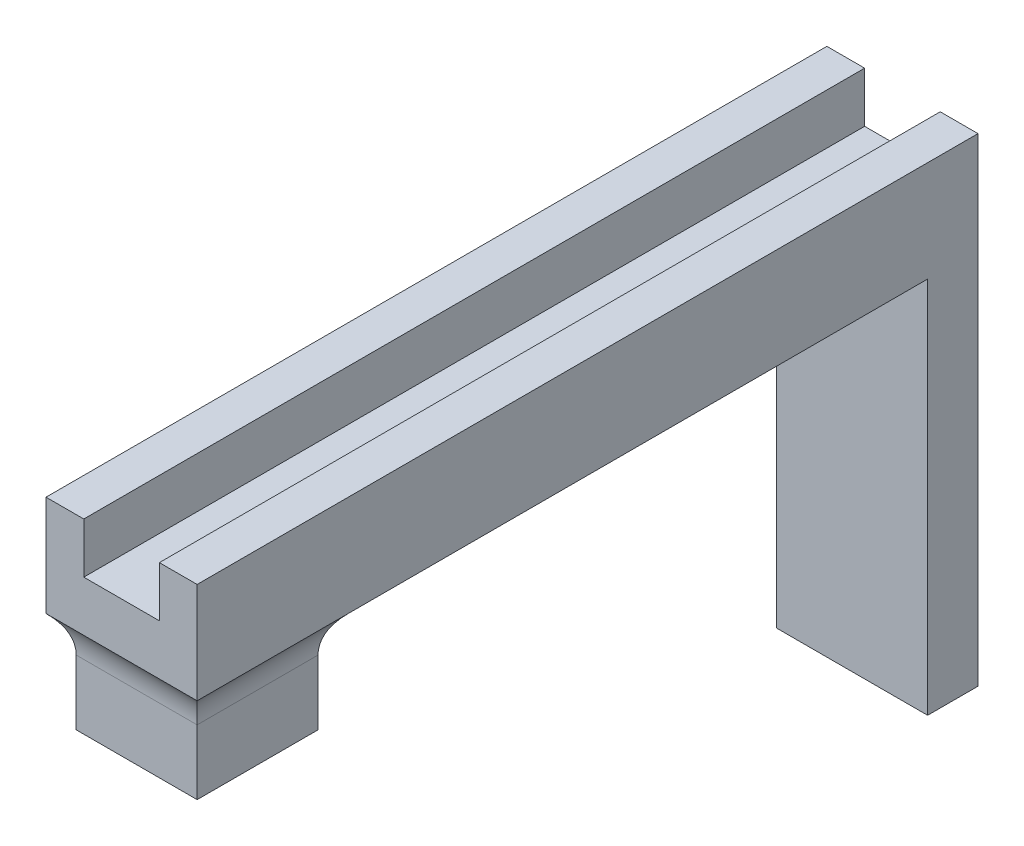
ISO-10303-21;
HEADER;
FILE_DESCRIPTION(('STEP AP214'),'2;1');
FILE_NAME('part.step','',(''),(''),'','','');
FILE_SCHEMA(('AUTOMOTIVE_DESIGN { 1 0 10303 214 1 1 1 1 }'));
ENDSEC;
DATA;
#1=APPLICATION_CONTEXT('core data for automotive mechanical design processes');
#2=APPLICATION_PROTOCOL_DEFINITION('international standard','automotive_design',2000,#1);
#3=PRODUCT_CONTEXT('',#1,'mechanical');
#4=PRODUCT('Part','Part','',(#3));
#5=PRODUCT_RELATED_PRODUCT_CATEGORY('part','',(#4));
#6=PRODUCT_DEFINITION_FORMATION('','',#4);
#7=PRODUCT_DEFINITION_CONTEXT('part definition',#1,'design');
#8=PRODUCT_DEFINITION('design','',#6,#7);
#9=PRODUCT_DEFINITION_SHAPE('','',#8);
#10=(LENGTH_UNIT() NAMED_UNIT(*) SI_UNIT(.MILLI.,.METRE.));
#11=(NAMED_UNIT(*) PLANE_ANGLE_UNIT() SI_UNIT($,.RADIAN.));
#12=(NAMED_UNIT(*) SI_UNIT($,.STERADIAN.) SOLID_ANGLE_UNIT());
#13=UNCERTAINTY_MEASURE_WITH_UNIT(LENGTH_MEASURE(1.E-05),#10,'distance_accuracy_value','');
#14=(GEOMETRIC_REPRESENTATION_CONTEXT(3) GLOBAL_UNCERTAINTY_ASSIGNED_CONTEXT((#13)) GLOBAL_UNIT_ASSIGNED_CONTEXT((#10,
#11,#12)) REPRESENTATION_CONTEXT('',''));
#15=CARTESIAN_POINT('',(0.,0.,0.));
#16=DIRECTION('',(0.,0.,1.));
#17=DIRECTION('',(1.,0.,0.));
#18=AXIS2_PLACEMENT_3D('',#15,#16,#17);
#19=CARTESIAN_POINT('',(6.858,5.08,-38.608));
#20=DIRECTION('',(0.,1.,0.));
#21=DIRECTION('',(0.,0.,1.));
#22=AXIS2_PLACEMENT_3D('',#19,#20,#21);
#23=PLANE('',#22);
#24=DIRECTION('',(-1.,0.,0.));
#25=VECTOR('',#24,1.);
#26=CARTESIAN_POINT('',(-0.762,5.08,-36.068));
#27=LINE('',#26,#25);
#28=CARTESIAN_POINT('',(6.858,5.08,-36.068));
#29=VERTEX_POINT('',#28);
#30=CARTESIAN_POINT('',(-0.762,5.08,-36.068));
#31=VERTEX_POINT('',#30);
#32=EDGE_CURVE('E275',#29,#31,#27,.T.);
#33=ORIENTED_EDGE('',*,*,#32,.F.);
#34=DIRECTION('',(0.,0.,1.));
#35=VECTOR('',#34,1.);
#36=CARTESIAN_POINT('',(6.858,5.08,-38.608));
#37=LINE('',#36,#35);
#38=CARTESIAN_POINT('',(6.858,5.08,-6.858));
#39=VERTEX_POINT('',#38);
#40=EDGE_CURVE('E152',#29,#39,#37,.T.);
#41=ORIENTED_EDGE('',*,*,#40,.T.);
#42=DIRECTION('',(-1.,0.,0.));
#43=VECTOR('',#42,1.);
#44=CARTESIAN_POINT('',(-0.762,5.08,-6.858));
#45=LINE('',#44,#43);
#46=CARTESIAN_POINT('',(-0.762,5.08,-6.858));
#47=VERTEX_POINT('',#46);
#48=EDGE_CURVE('E193',#39,#47,#45,.T.);
#49=ORIENTED_EDGE('',*,*,#48,.T.);
#50=DIRECTION('',(0.,0.,1.));
#51=VECTOR('',#50,1.);
#52=CARTESIAN_POINT('',(-0.762,5.08,-38.608));
#53=LINE('',#52,#51);
#54=EDGE_CURVE('E80',#31,#47,#53,.T.);
#55=ORIENTED_EDGE('',*,*,#54,.F.);
#56=EDGE_LOOP('',(#33,#41,#49,#55));
#57=FACE_BOUND('',#56,.T.);
#58=ADVANCED_FACE('F42',(#57),#23,.F.);
#59=CARTESIAN_POINT('',(0.,10.16,0.));
#60=DIRECTION('',(0.,1.,0.));
#61=DIRECTION('',(0.,0.,1.));
#62=AXIS2_PLACEMENT_3D('',#59,#60,#61);
#63=PLANE('',#62);
#64=DIRECTION('',(0.,0.,1.));
#65=VECTOR('',#64,1.);
#66=CARTESIAN_POINT('',(1.143,10.16,-38.608));
#67=LINE('',#66,#65);
#68=CARTESIAN_POINT('',(1.143,10.16,-38.608));
#69=VERTEX_POINT('',#68);
#70=CARTESIAN_POINT('',(1.14300000000001,10.16,0.762));
#71=VERTEX_POINT('',#70);
#72=EDGE_CURVE('E253',#69,#71,#67,.T.);
#73=ORIENTED_EDGE('',*,*,#72,.F.);
#74=DIRECTION('',(1.,0.,0.));
#75=VECTOR('',#74,1.);
#76=CARTESIAN_POINT('',(6.858,10.16,-38.608));
#77=LINE('',#76,#75);
#78=CARTESIAN_POINT('',(-0.762,10.16,-38.608));
#79=VERTEX_POINT('',#78);
#80=EDGE_CURVE('E218',#79,#69,#77,.T.);
#81=ORIENTED_EDGE('',*,*,#80,.F.);
#82=DIRECTION('',(0.,0.,1.));
#83=VECTOR('',#82,1.);
#84=CARTESIAN_POINT('',(-0.762,10.16,-6.858));
#85=LINE('',#84,#83);
#86=CARTESIAN_POINT('',(-0.761999999999999,10.16,0.762));
#87=VERTEX_POINT('',#86);
#88=EDGE_CURVE('E197',#79,#87,#85,.T.);
#89=ORIENTED_EDGE('',*,*,#88,.T.);
#90=DIRECTION('',(1.,0.,0.));
#91=VECTOR('',#90,1.);
#92=CARTESIAN_POINT('',(-0.761999999999999,10.16,0.762));
#93=LINE('',#92,#91);
#94=EDGE_CURVE('E208',#87,#71,#93,.T.);
#95=ORIENTED_EDGE('',*,*,#94,.T.);
#96=EDGE_LOOP('',(#73,#81,#89,#95));
#97=FACE_BOUND('',#96,.T.);
#98=ADVANCED_FACE('F368',(#97),#63,.T.);
#99=CARTESIAN_POINT('',(0.,5.08,0.));
#100=DIRECTION('',(1.,0.,0.));
#101=DIRECTION('',(0.,0.,-1.));
#102=AXIS2_PLACEMENT_3D('',#99,#100,#101);
#103=PLANE('',#102);
#104=DIRECTION('',(0.,-1.,0.));
#105=VECTOR('',#104,1.);
#106=CARTESIAN_POINT('',(0.,5.08,0.));
#107=LINE('',#106,#105);
#108=CARTESIAN_POINT('',(0.,3.26607717915012,0.));
#109=VERTEX_POINT('',#108);
#110=CARTESIAN_POINT('',(0.,0.,0.));
#111=VERTEX_POINT('',#110);
#112=EDGE_CURVE('E139',#109,#111,#107,.T.);
#113=ORIENTED_EDGE('',*,*,#112,.F.);
#114=DIRECTION('',(0.,0.,-1.));
#115=VECTOR('',#114,1.);
#116=CARTESIAN_POINT('',(0.,3.26607717915012,0.));
#117=LINE('',#116,#115);
#118=CARTESIAN_POINT('',(0.,3.26607717915012,-6.096));
#119=VERTEX_POINT('',#118);
#120=EDGE_CURVE('E145',#109,#119,#117,.T.);
#121=ORIENTED_EDGE('',*,*,#120,.T.);
#122=DIRECTION('',(0.,-1.,0.));
#123=VECTOR('',#122,1.);
#124=CARTESIAN_POINT('',(0.,5.08,-6.096));
#125=LINE('',#124,#123);
#126=CARTESIAN_POINT('',(0.,0.,-6.096));
#127=VERTEX_POINT('',#126);
#128=EDGE_CURVE('E169',#119,#127,#125,.T.);
#129=ORIENTED_EDGE('',*,*,#128,.T.);
#130=DIRECTION('',(0.,0.,1.));
#131=VECTOR('',#130,1.);
#132=CARTESIAN_POINT('',(0.,0.,0.));
#133=LINE('',#132,#131);
#134=EDGE_CURVE('E181',#127,#111,#133,.T.);
#135=ORIENTED_EDGE('',*,*,#134,.T.);
#136=EDGE_LOOP('',(#113,#121,#129,#135));
#137=FACE_BOUND('',#136,.T.);
#138=ADVANCED_FACE('F375',(#137),#103,.F.);
#139=CARTESIAN_POINT('',(0.,5.08,0.));
#140=DIRECTION('',(0.,0.,-1.));
#141=DIRECTION('',(-1.,0.,0.));
#142=AXIS2_PLACEMENT_3D('',#139,#140,#141);
#143=PLANE('',#142);
#144=DIRECTION('',(0.,-1.,0.));
#145=VECTOR('',#144,1.);
#146=CARTESIAN_POINT('',(6.096,5.08,0.));
#147=LINE('',#146,#145);
#148=CARTESIAN_POINT('',(6.096,3.26607717915012,0.));
#149=VERTEX_POINT('',#148);
#150=CARTESIAN_POINT('',(6.096,0.,0.));
#151=VERTEX_POINT('',#150);
#152=EDGE_CURVE('E122',#149,#151,#147,.T.);
#153=ORIENTED_EDGE('',*,*,#152,.F.);
#154=DIRECTION('',(-1.,0.,0.));
#155=VECTOR('',#154,1.);
#156=CARTESIAN_POINT('',(0.,3.26607717915012,0.));
#157=LINE('',#156,#155);
#158=EDGE_CURVE('E130',#149,#109,#157,.T.);
#159=ORIENTED_EDGE('',*,*,#158,.T.);
#160=ORIENTED_EDGE('',*,*,#112,.T.);
#161=DIRECTION('',(1.,0.,0.));
#162=VECTOR('',#161,1.);
#163=CARTESIAN_POINT('',(0.,0.,0.));
#164=LINE('',#163,#162);
#165=EDGE_CURVE('E136',#111,#151,#164,.T.);
#166=ORIENTED_EDGE('',*,*,#165,.T.);
#167=EDGE_LOOP('',(#153,#159,#160,#166));
#168=FACE_BOUND('',#167,.T.);
#169=ADVANCED_FACE('F133',(#168),#143,.F.);
#170=CARTESIAN_POINT('',(6.096,5.08,0.));
#171=DIRECTION('',(-1.,0.,0.));
#172=DIRECTION('',(0.,0.,1.));
#173=AXIS2_PLACEMENT_3D('',#170,#171,#172);
#174=PLANE('',#173);
#175=DIRECTION('',(0.,-1.,0.));
#176=VECTOR('',#175,1.);
#177=CARTESIAN_POINT('',(6.096,5.08,-6.096));
#178=LINE('',#177,#176);
#179=CARTESIAN_POINT('',(6.096,3.26607717915012,-6.096));
#180=VERTEX_POINT('',#179);
#181=CARTESIAN_POINT('',(6.096,0.,-6.096));
#182=VERTEX_POINT('',#181);
#183=EDGE_CURVE('E124',#180,#182,#178,.T.);
#184=ORIENTED_EDGE('',*,*,#183,.F.);
#185=DIRECTION('',(0.,0.,1.));
#186=VECTOR('',#185,1.);
#187=CARTESIAN_POINT('',(6.096,3.26607717915012,0.));
#188=LINE('',#187,#186);
#189=EDGE_CURVE('E118',#180,#149,#188,.T.);
#190=ORIENTED_EDGE('',*,*,#189,.T.);
#191=ORIENTED_EDGE('',*,*,#152,.T.);
#192=DIRECTION('',(0.,0.,-1.));
#193=VECTOR('',#192,1.);
#194=CARTESIAN_POINT('',(6.096,0.,0.));
#195=LINE('',#194,#193);
#196=EDGE_CURVE('E176',#151,#182,#195,.T.);
#197=ORIENTED_EDGE('',*,*,#196,.T.);
#198=EDGE_LOOP('',(#184,#190,#191,#197));
#199=FACE_BOUND('',#198,.T.);
#200=ADVANCED_FACE('F120',(#199),#174,.F.);
#201=CARTESIAN_POINT('',(0.,5.08,-6.096));
#202=DIRECTION('',(0.,0.,1.));
#203=DIRECTION('',(1.,0.,0.));
#204=AXIS2_PLACEMENT_3D('',#201,#202,#203);
#205=PLANE('',#204);
#206=ORIENTED_EDGE('',*,*,#128,.F.);
#207=DIRECTION('',(1.,0.,0.));
#208=VECTOR('',#207,1.);
#209=CARTESIAN_POINT('',(0.,3.26607717915012,-6.096));
#210=LINE('',#209,#208);
#211=EDGE_CURVE('E129',#119,#180,#210,.T.);
#212=ORIENTED_EDGE('',*,*,#211,.T.);
#213=ORIENTED_EDGE('',*,*,#183,.T.);
#214=DIRECTION('',(-1.,0.,0.));
#215=VECTOR('',#214,1.);
#216=CARTESIAN_POINT('',(0.,0.,-6.096));
#217=LINE('',#216,#215);
#218=EDGE_CURVE('E172',#182,#127,#217,.T.);
#219=ORIENTED_EDGE('',*,*,#218,.T.);
#220=EDGE_LOOP('',(#206,#212,#213,#219));
#221=FACE_BOUND('',#220,.T.);
#222=ADVANCED_FACE('F377',(#221),#205,.F.);
#223=CARTESIAN_POINT('',(0.,0.,0.));
#224=DIRECTION('',(0.,-1.,0.));
#225=DIRECTION('',(0.,0.,-1.));
#226=AXIS2_PLACEMENT_3D('',#223,#224,#225);
#227=PLANE('',#226);
#228=ORIENTED_EDGE('',*,*,#134,.F.);
#229=ORIENTED_EDGE('',*,*,#218,.F.);
#230=ORIENTED_EDGE('',*,*,#196,.F.);
#231=ORIENTED_EDGE('',*,*,#165,.F.);
#232=EDGE_LOOP('',(#228,#229,#230,#231));
#233=FACE_BOUND('',#232,.T.);
#234=ADVANCED_FACE('F381',(#233),#227,.T.);
#235=CARTESIAN_POINT('',(-0.762,10.16,-6.858));
#236=DIRECTION('',(1.,0.,0.));
#237=DIRECTION('',(0.,0.,-1.));
#238=AXIS2_PLACEMENT_3D('',#235,#236,#237);
#239=PLANE('',#238);
#240=ORIENTED_EDGE('',*,*,#88,.F.);
#241=DIRECTION('',(0.,1.,0.));
#242=VECTOR('',#241,1.);
#243=CARTESIAN_POINT('',(-0.762,10.16,-38.608));
#244=LINE('',#243,#242);
#245=CARTESIAN_POINT('',(-0.762,-13.97,-38.608));
#246=VERTEX_POINT('',#245);
#247=EDGE_CURVE('E223',#246,#79,#244,.T.);
#248=ORIENTED_EDGE('',*,*,#247,.F.);
#249=DIRECTION('',(0.,0.,-1.));
#250=VECTOR('',#249,1.);
#251=CARTESIAN_POINT('',(-0.762,-13.97,-38.608));
#252=LINE('',#251,#250);
#253=CARTESIAN_POINT('',(-0.762,-13.97,-36.068));
#254=VERTEX_POINT('',#253);
#255=EDGE_CURVE('E279',#254,#246,#252,.T.);
#256=ORIENTED_EDGE('',*,*,#255,.F.);
#257=DIRECTION('',(0.,1.,0.));
#258=VECTOR('',#257,1.);
#259=CARTESIAN_POINT('',(-0.762,-13.97,-36.068));
#260=LINE('',#259,#258);
#261=EDGE_CURVE('E271',#254,#31,#260,.T.);
#262=ORIENTED_EDGE('',*,*,#261,.T.);
#263=ORIENTED_EDGE('',*,*,#54,.T.);
#264=DIRECTION('',(0.,0.,1.));
#265=VECTOR('',#264,1.);
#266=CARTESIAN_POINT('',(-0.762,5.08,-6.858));
#267=LINE('',#266,#265);
#268=CARTESIAN_POINT('',(-0.761999999999999,5.08,0.762));
#269=VERTEX_POINT('',#268);
#270=EDGE_CURVE('E69',#47,#269,#267,.T.);
#271=ORIENTED_EDGE('',*,*,#270,.T.);
#272=DIRECTION('',(0.,-1.,0.));
#273=VECTOR('',#272,1.);
#274=CARTESIAN_POINT('',(-0.761999999999999,10.16,0.762));
#275=LINE('',#274,#273);
#276=EDGE_CURVE('E185',#87,#269,#275,.T.);
#277=ORIENTED_EDGE('',*,*,#276,.F.);
#278=EDGE_LOOP('',(#240,#248,#256,#262,#263,#271,#277));
#279=FACE_BOUND('',#278,.T.);
#280=ADVANCED_FACE('F307',(#279),#239,.F.);
#281=CARTESIAN_POINT('',(-0.761999999999999,10.16,0.762));
#282=DIRECTION('',(0.,0.,-1.));
#283=DIRECTION('',(-1.,0.,0.));
#284=AXIS2_PLACEMENT_3D('',#281,#282,#283);
#285=PLANE('',#284);
#286=DIRECTION('',(1.,0.,0.));
#287=VECTOR('',#286,1.);
#288=CARTESIAN_POINT('',(1.14300000000001,7.62,0.762));
#289=LINE('',#288,#287);
#290=CARTESIAN_POINT('',(1.14300000000001,7.62,0.762));
#291=VERTEX_POINT('',#290);
#292=CARTESIAN_POINT('',(4.953,7.62,0.762));
#293=VERTEX_POINT('',#292);
#294=EDGE_CURVE('E262',#291,#293,#289,.T.);
#295=ORIENTED_EDGE('',*,*,#294,.F.);
#296=DIRECTION('',(0.,1.,0.));
#297=VECTOR('',#296,1.);
#298=CARTESIAN_POINT('',(1.14300000000001,7.62,0.762));
#299=LINE('',#298,#297);
#300=EDGE_CURVE('E232',#291,#71,#299,.T.);
#301=ORIENTED_EDGE('',*,*,#300,.T.);
#302=ORIENTED_EDGE('',*,*,#94,.F.);
#303=ORIENTED_EDGE('',*,*,#276,.T.);
#304=DIRECTION('',(1.,0.,0.));
#305=VECTOR('',#304,1.);
#306=CARTESIAN_POINT('',(-0.761999999999999,5.08,0.762));
#307=LINE('',#306,#305);
#308=CARTESIAN_POINT('',(6.858,5.08,0.762));
#309=VERTEX_POINT('',#308);
#310=EDGE_CURVE('E200',#269,#309,#307,.T.);
#311=ORIENTED_EDGE('',*,*,#310,.T.);
#312=DIRECTION('',(0.,-1.,0.));
#313=VECTOR('',#312,1.);
#314=CARTESIAN_POINT('',(6.858,10.16,0.762));
#315=LINE('',#314,#313);
#316=CARTESIAN_POINT('',(6.858,10.16,0.762));
#317=VERTEX_POINT('',#316);
#318=EDGE_CURVE('E188',#317,#309,#315,.T.);
#319=ORIENTED_EDGE('',*,*,#318,.F.);
#320=CARTESIAN_POINT('',(4.953,10.16,0.762));
#321=VERTEX_POINT('',#320);
#322=EDGE_CURVE('E212',#321,#317,#93,.T.);
#323=ORIENTED_EDGE('',*,*,#322,.F.);
#324=DIRECTION('',(0.,1.,0.));
#325=VECTOR('',#324,1.);
#326=CARTESIAN_POINT('',(4.953,7.62,0.762));
#327=LINE('',#326,#325);
#328=EDGE_CURVE('E236',#293,#321,#327,.T.);
#329=ORIENTED_EDGE('',*,*,#328,.F.);
#330=EDGE_LOOP('',(#295,#301,#302,#303,#311,#319,#323,#329));
#331=FACE_BOUND('',#330,.T.);
#332=ADVANCED_FACE('F350',(#331),#285,.F.);
#333=CARTESIAN_POINT('',(6.858,10.16,-6.858));
#334=DIRECTION('',(-1.,0.,0.));
#335=DIRECTION('',(0.,0.,1.));
#336=AXIS2_PLACEMENT_3D('',#333,#334,#335);
#337=PLANE('',#336);
#338=DIRECTION('',(0.,0.,-1.));
#339=VECTOR('',#338,1.);
#340=CARTESIAN_POINT('',(6.858,5.08,-6.858));
#341=LINE('',#340,#339);
#342=EDGE_CURVE('E149',#309,#39,#341,.T.);
#343=ORIENTED_EDGE('',*,*,#342,.T.);
#344=ORIENTED_EDGE('',*,*,#40,.F.);
#345=DIRECTION('',(0.,1.,0.));
#346=VECTOR('',#345,1.);
#347=CARTESIAN_POINT('',(6.858,-13.97,-36.068));
#348=LINE('',#347,#346);
#349=CARTESIAN_POINT('',(6.858,-13.97,-36.068));
#350=VERTEX_POINT('',#349);
#351=EDGE_CURVE('E257',#350,#29,#348,.T.);
#352=ORIENTED_EDGE('',*,*,#351,.F.);
#353=DIRECTION('',(0.,0.,1.));
#354=VECTOR('',#353,1.);
#355=CARTESIAN_POINT('',(6.858,-13.97,-38.608));
#356=LINE('',#355,#354);
#357=CARTESIAN_POINT('',(6.858,-13.97,-38.608));
#358=VERTEX_POINT('',#357);
#359=EDGE_CURVE('E283',#358,#350,#356,.T.);
#360=ORIENTED_EDGE('',*,*,#359,.F.);
#361=DIRECTION('',(0.,-1.,0.));
#362=VECTOR('',#361,1.);
#363=CARTESIAN_POINT('',(6.858,10.16,-38.608));
#364=LINE('',#363,#362);
#365=CARTESIAN_POINT('',(6.858,10.16,-38.608));
#366=VERTEX_POINT('',#365);
#367=EDGE_CURVE('E227',#366,#358,#364,.T.);
#368=ORIENTED_EDGE('',*,*,#367,.F.);
#369=DIRECTION('',(0.,0.,-1.));
#370=VECTOR('',#369,1.);
#371=CARTESIAN_POINT('',(6.858,10.16,-6.858));
#372=LINE('',#371,#370);
#373=EDGE_CURVE('E192',#317,#366,#372,.T.);
#374=ORIENTED_EDGE('',*,*,#373,.F.);
#375=ORIENTED_EDGE('',*,*,#318,.T.);
#376=EDGE_LOOP('',(#343,#344,#352,#360,#368,#374,#375));
#377=FACE_BOUND('',#376,.T.);
#378=ADVANCED_FACE('F343',(#377),#337,.F.);
#379=DIRECTION('',(0.,0.,-1.));
#380=VECTOR('',#379,1.);
#381=CARTESIAN_POINT('',(4.953,10.16,-38.608));
#382=LINE('',#381,#380);
#383=CARTESIAN_POINT('',(4.953,10.16,-38.608));
#384=VERTEX_POINT('',#383);
#385=EDGE_CURVE('E248',#321,#384,#382,.T.);
#386=ORIENTED_EDGE('',*,*,#385,.F.);
#387=ORIENTED_EDGE('',*,*,#322,.T.);
#388=ORIENTED_EDGE('',*,*,#373,.T.);
#389=EDGE_CURVE('E222',#384,#366,#77,.T.);
#390=ORIENTED_EDGE('',*,*,#389,.F.);
#391=EDGE_LOOP('',(#386,#387,#388,#390));
#392=FACE_BOUND('',#391,.T.);
#393=ADVANCED_FACE('F355',(#392),#63,.T.);
#394=CARTESIAN_POINT('',(-2.54,3.26607717915012,0.));
#395=DIRECTION('',(0.,0.,-1.));
#396=DIRECTION('',(-1.,0.,0.));
#397=AXIS2_PLACEMENT_3D('',#394,#395,#396);
#398=CYLINDRICAL_SURFACE('',#397,2.54);
#399=ORIENTED_EDGE('',*,*,#270,.F.);
#400=CARTESIAN_POINT('',(-2.54,3.26607717915012,-8.636));
#401=DIRECTION('',(0.707106781186547,0.,-0.707106781186548));
#402=DIRECTION('',(-0.707106781186548,0.,-0.707106781186547));
#403=AXIS2_PLACEMENT_3D('',#400,#401,#402);
#404=ELLIPSE('',#403,3.59210244842766,2.54);
#405=EDGE_CURVE('E11',#47,#119,#404,.T.);
#406=ORIENTED_EDGE('',*,*,#405,.T.);
#407=ORIENTED_EDGE('',*,*,#120,.F.);
#408=CARTESIAN_POINT('',(-2.54,3.26607717915012,2.54));
#409=DIRECTION('',(-0.707106781186548,0.,-0.707106781186547));
#410=DIRECTION('',(0.707106781186547,0.,-0.707106781186548));
#411=AXIS2_PLACEMENT_3D('',#408,#409,#410);
#412=ELLIPSE('',#411,3.59210244842766,2.54);
#413=EDGE_CURVE('E52',#109,#269,#412,.F.);
#414=ORIENTED_EDGE('',*,*,#413,.T.);
#415=EDGE_LOOP('',(#399,#406,#407,#414));
#416=FACE_BOUND('',#415,.T.);
#417=ADVANCED_FACE('F372',(#416),#398,.F.);
#418=CARTESIAN_POINT('',(0.,3.26607717915012,-8.636));
#419=DIRECTION('',(1.,0.,0.));
#420=DIRECTION('',(0.,0.,-1.));
#421=AXIS2_PLACEMENT_3D('',#418,#419,#420);
#422=CYLINDRICAL_SURFACE('',#421,2.54);
#423=ORIENTED_EDGE('',*,*,#405,.F.);
#424=ORIENTED_EDGE('',*,*,#48,.F.);
#425=CARTESIAN_POINT('',(8.636,3.26607717915012,-8.636));
#426=DIRECTION('',(0.707106781186548,0.,0.707106781186547));
#427=DIRECTION('',(0.707106781186547,0.,-0.707106781186548));
#428=AXIS2_PLACEMENT_3D('',#425,#426,#427);
#429=ELLIPSE('',#428,3.59210244842766,2.54);
#430=EDGE_CURVE('E46',#180,#39,#429,.F.);
#431=ORIENTED_EDGE('',*,*,#430,.F.);
#432=ORIENTED_EDGE('',*,*,#211,.F.);
#433=EDGE_LOOP('',(#423,#424,#431,#432));
#434=FACE_BOUND('',#433,.T.);
#435=ADVANCED_FACE('F44',(#434),#422,.F.);
#436=CARTESIAN_POINT('',(8.636,3.26607717915012,0.));
#437=DIRECTION('',(0.,0.,1.));
#438=DIRECTION('',(1.,0.,0.));
#439=AXIS2_PLACEMENT_3D('',#436,#437,#438);
#440=CYLINDRICAL_SURFACE('',#439,2.54);
#441=ORIENTED_EDGE('',*,*,#430,.T.);
#442=ORIENTED_EDGE('',*,*,#342,.F.);
#443=CARTESIAN_POINT('',(8.636,3.26607717915012,2.54));
#444=DIRECTION('',(-0.707106781186547,0.,0.707106781186548));
#445=DIRECTION('',(-0.707106781186548,0.,-0.707106781186547));
#446=AXIS2_PLACEMENT_3D('',#443,#444,#445);
#447=ELLIPSE('',#446,3.59210244842766,2.54);
#448=EDGE_CURVE('E91',#149,#309,#447,.F.);
#449=ORIENTED_EDGE('',*,*,#448,.F.);
#450=ORIENTED_EDGE('',*,*,#189,.F.);
#451=EDGE_LOOP('',(#441,#442,#449,#450));
#452=FACE_BOUND('',#451,.T.);
#453=ADVANCED_FACE('F147',(#452),#440,.F.);
#454=CARTESIAN_POINT('',(0.,3.26607717915012,2.54));
#455=DIRECTION('',(-1.,0.,0.));
#456=DIRECTION('',(0.,0.,1.));
#457=AXIS2_PLACEMENT_3D('',#454,#455,#456);
#458=CYLINDRICAL_SURFACE('',#457,2.54);
#459=ORIENTED_EDGE('',*,*,#413,.F.);
#460=ORIENTED_EDGE('',*,*,#158,.F.);
#461=ORIENTED_EDGE('',*,*,#448,.T.);
#462=ORIENTED_EDGE('',*,*,#310,.F.);
#463=EDGE_LOOP('',(#459,#460,#461,#462));
#464=FACE_BOUND('',#463,.T.);
#465=ADVANCED_FACE('F142',(#464),#458,.F.);
#466=CARTESIAN_POINT('',(0.,0.,-38.608));
#467=DIRECTION('',(0.,0.,-1.));
#468=DIRECTION('',(-1.,0.,0.));
#469=AXIS2_PLACEMENT_3D('',#466,#467,#468);
#470=PLANE('',#469);
#471=DIRECTION('',(0.,1.,0.));
#472=VECTOR('',#471,1.);
#473=CARTESIAN_POINT('',(1.143,7.62,-38.608));
#474=LINE('',#473,#472);
#475=CARTESIAN_POINT('',(1.143,7.62,-38.608));
#476=VERTEX_POINT('',#475);
#477=EDGE_CURVE('E231',#476,#69,#474,.T.);
#478=ORIENTED_EDGE('',*,*,#477,.F.);
#479=DIRECTION('',(-1.,0.,0.));
#480=VECTOR('',#479,1.);
#481=CARTESIAN_POINT('',(1.143,7.62,-38.608));
#482=LINE('',#481,#480);
#483=CARTESIAN_POINT('',(4.953,7.62,-38.608));
#484=VERTEX_POINT('',#483);
#485=EDGE_CURVE('E237',#484,#476,#482,.T.);
#486=ORIENTED_EDGE('',*,*,#485,.F.);
#487=DIRECTION('',(0.,1.,0.));
#488=VECTOR('',#487,1.);
#489=CARTESIAN_POINT('',(4.953,7.62,-38.608));
#490=LINE('',#489,#488);
#491=EDGE_CURVE('E241',#484,#384,#490,.T.);
#492=ORIENTED_EDGE('',*,*,#491,.T.);
#493=ORIENTED_EDGE('',*,*,#389,.T.);
#494=ORIENTED_EDGE('',*,*,#367,.T.);
#495=DIRECTION('',(1.,0.,0.));
#496=VECTOR('',#495,1.);
#497=CARTESIAN_POINT('',(-0.762,-13.97,-38.608));
#498=LINE('',#497,#496);
#499=EDGE_CURVE('E287',#246,#358,#498,.T.);
#500=ORIENTED_EDGE('',*,*,#499,.F.);
#501=ORIENTED_EDGE('',*,*,#247,.T.);
#502=ORIENTED_EDGE('',*,*,#80,.T.);
#503=EDGE_LOOP('',(#478,#486,#492,#493,#494,#500,#501,#502));
#504=FACE_BOUND('',#503,.T.);
#505=ADVANCED_FACE('F363',(#504),#470,.T.);
#506=CARTESIAN_POINT('',(1.143,7.62,-38.608));
#507=DIRECTION('',(-1.,0.,0.));
#508=DIRECTION('',(0.,0.,1.));
#509=AXIS2_PLACEMENT_3D('',#506,#507,#508);
#510=PLANE('',#509);
#511=ORIENTED_EDGE('',*,*,#72,.T.);
#512=ORIENTED_EDGE('',*,*,#300,.F.);
#513=DIRECTION('',(0.,0.,1.));
#514=VECTOR('',#513,1.);
#515=CARTESIAN_POINT('',(1.143,7.62,-38.608));
#516=LINE('',#515,#514);
#517=EDGE_CURVE('E252',#476,#291,#516,.T.);
#518=ORIENTED_EDGE('',*,*,#517,.F.);
#519=ORIENTED_EDGE('',*,*,#477,.T.);
#520=EDGE_LOOP('',(#511,#512,#518,#519));
#521=FACE_BOUND('',#520,.T.);
#522=ADVANCED_FACE('F446',(#521),#510,.F.);
#523=CARTESIAN_POINT('',(4.953,7.62,-38.608));
#524=DIRECTION('',(1.,0.,0.));
#525=DIRECTION('',(0.,0.,-1.));
#526=AXIS2_PLACEMENT_3D('',#523,#524,#525);
#527=PLANE('',#526);
#528=ORIENTED_EDGE('',*,*,#385,.T.);
#529=ORIENTED_EDGE('',*,*,#491,.F.);
#530=DIRECTION('',(0.,0.,-1.));
#531=VECTOR('',#530,1.);
#532=CARTESIAN_POINT('',(4.953,7.62,-38.608));
#533=LINE('',#532,#531);
#534=EDGE_CURVE('E60',#293,#484,#533,.T.);
#535=ORIENTED_EDGE('',*,*,#534,.F.);
#536=ORIENTED_EDGE('',*,*,#328,.T.);
#537=EDGE_LOOP('',(#528,#529,#535,#536));
#538=FACE_BOUND('',#537,.T.);
#539=ADVANCED_FACE('F359',(#538),#527,.F.);
#540=CARTESIAN_POINT('',(0.,7.62,0.));
#541=DIRECTION('',(0.,1.,0.));
#542=DIRECTION('',(0.,0.,1.));
#543=AXIS2_PLACEMENT_3D('',#540,#541,#542);
#544=PLANE('',#543);
#545=ORIENTED_EDGE('',*,*,#517,.T.);
#546=ORIENTED_EDGE('',*,*,#294,.T.);
#547=ORIENTED_EDGE('',*,*,#534,.T.);
#548=ORIENTED_EDGE('',*,*,#485,.T.);
#549=EDGE_LOOP('',(#545,#546,#547,#548));
#550=FACE_BOUND('',#549,.T.);
#551=ADVANCED_FACE('F364',(#550),#544,.T.);
#552=CARTESIAN_POINT('',(-0.762,-13.97,-36.068));
#553=DIRECTION('',(0.,0.,-1.));
#554=DIRECTION('',(-1.,0.,0.));
#555=AXIS2_PLACEMENT_3D('',#552,#553,#554);
#556=PLANE('',#555);
#557=ORIENTED_EDGE('',*,*,#32,.T.);
#558=ORIENTED_EDGE('',*,*,#261,.F.);
#559=DIRECTION('',(-1.,0.,0.));
#560=VECTOR('',#559,1.);
#561=CARTESIAN_POINT('',(-0.762,-13.97,-36.068));
#562=LINE('',#561,#560);
#563=EDGE_CURVE('E274',#350,#254,#562,.T.);
#564=ORIENTED_EDGE('',*,*,#563,.F.);
#565=ORIENTED_EDGE('',*,*,#351,.T.);
#566=EDGE_LOOP('',(#557,#558,#564,#565));
#567=FACE_BOUND('',#566,.T.);
#568=ADVANCED_FACE('F463',(#567),#556,.F.);
#569=CARTESIAN_POINT('',(0.,-13.97,0.));
#570=DIRECTION('',(0.,1.,0.));
#571=DIRECTION('',(0.,0.,1.));
#572=AXIS2_PLACEMENT_3D('',#569,#570,#571);
#573=PLANE('',#572);
#574=ORIENTED_EDGE('',*,*,#255,.T.);
#575=ORIENTED_EDGE('',*,*,#499,.T.);
#576=ORIENTED_EDGE('',*,*,#359,.T.);
#577=ORIENTED_EDGE('',*,*,#563,.T.);
#578=EDGE_LOOP('',(#574,#575,#576,#577));
#579=FACE_BOUND('',#578,.T.);
#580=ADVANCED_FACE('F296',(#579),#573,.F.);
#581=CLOSED_SHELL('',(#58,#98,#138,#169,#200,#222,#234,#280,#332,#378,#393,#417,#435,#453,#465,
#505,#522,#539,#551,#568,#580));
#582=MANIFOLD_SOLID_BREP('B2',#581);
#583=ADVANCED_BREP_SHAPE_REPRESENTATION('',(#18,#582),#14);
#584=SHAPE_DEFINITION_REPRESENTATION(#9,#583);
ENDSEC;
END-ISO-10303-21;
